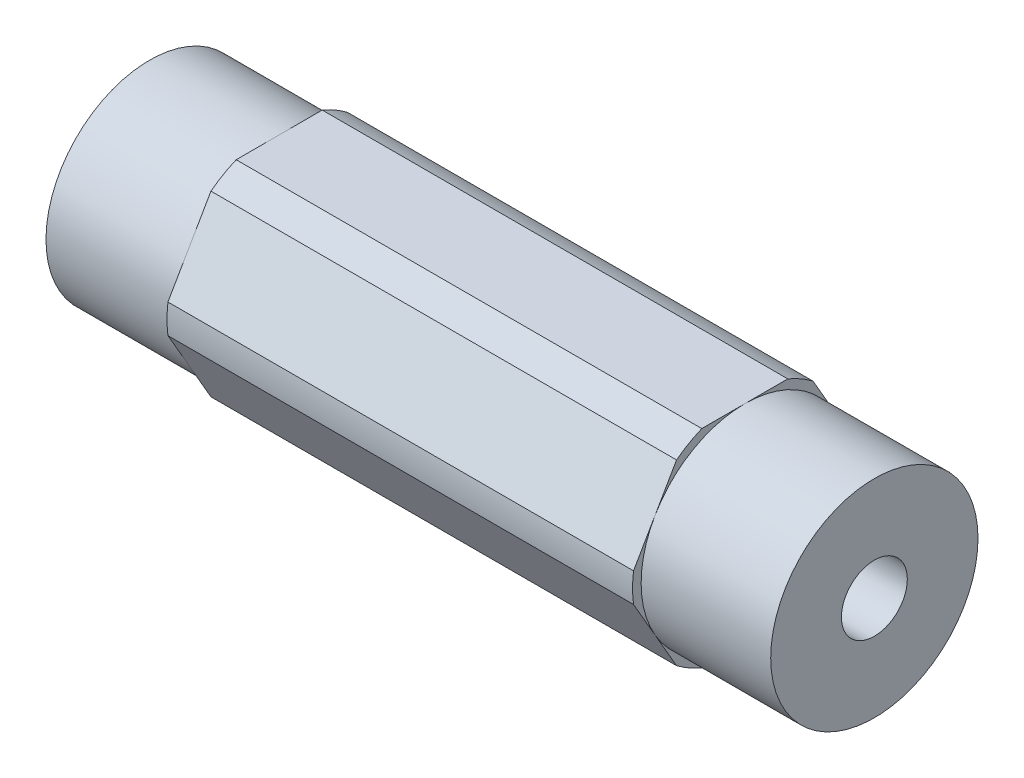
ISO-10303-21;
HEADER;
FILE_DESCRIPTION(('STEP AP214'),'2;1');
FILE_NAME('part.step','',(''),(''),'','','');
FILE_SCHEMA(('AUTOMOTIVE_DESIGN { 1 0 10303 214 1 1 1 1 }'));
ENDSEC;
DATA;
#1=APPLICATION_CONTEXT('core data for automotive mechanical design processes');
#2=APPLICATION_PROTOCOL_DEFINITION('international standard','automotive_design',2000,#1);
#3=PRODUCT_CONTEXT('',#1,'mechanical');
#4=PRODUCT('Part','Part','',(#3));
#5=PRODUCT_RELATED_PRODUCT_CATEGORY('part','',(#4));
#6=PRODUCT_DEFINITION_FORMATION('','',#4);
#7=PRODUCT_DEFINITION_CONTEXT('part definition',#1,'design');
#8=PRODUCT_DEFINITION('design','',#6,#7);
#9=PRODUCT_DEFINITION_SHAPE('','',#8);
#10=(LENGTH_UNIT() NAMED_UNIT(*) SI_UNIT(.MILLI.,.METRE.));
#11=(NAMED_UNIT(*) PLANE_ANGLE_UNIT() SI_UNIT($,.RADIAN.));
#12=(NAMED_UNIT(*) SI_UNIT($,.STERADIAN.) SOLID_ANGLE_UNIT());
#13=UNCERTAINTY_MEASURE_WITH_UNIT(LENGTH_MEASURE(1.E-05),#10,'distance_accuracy_value','');
#14=(GEOMETRIC_REPRESENTATION_CONTEXT(3) GLOBAL_UNCERTAINTY_ASSIGNED_CONTEXT((#13)) GLOBAL_UNIT_ASSIGNED_CONTEXT((#10,
#11,#12)) REPRESENTATION_CONTEXT('',''));
#15=CARTESIAN_POINT('',(0.,0.,0.));
#16=DIRECTION('',(0.,0.,1.));
#17=DIRECTION('',(1.,0.,0.));
#18=AXIS2_PLACEMENT_3D('',#15,#16,#17);
#19=CARTESIAN_POINT('',(-22.1996,0.,0.));
#20=DIRECTION('',(1.,0.,0.));
#21=DIRECTION('',(0.,0.,-1.));
#22=AXIS2_PLACEMENT_3D('',#19,#20,#21);
#23=PLANE('',#22);
#24=CARTESIAN_POINT('',(-22.1996,0.,0.));
#25=DIRECTION('',(1.,0.,0.));
#26=DIRECTION('',(0.,0.,-1.));
#27=AXIS2_PLACEMENT_3D('',#24,#25,#26);
#28=CIRCLE('',#27,2.0193);
#29=CARTESIAN_POINT('',(-22.1996,0.,-2.0193));
#30=VERTEX_POINT('',#29);
#31=EDGE_CURVE('E263',#30,#30,#28,.T.);
#32=ORIENTED_EDGE('',*,*,#31,.T.);
#33=EDGE_LOOP('',(#32));
#34=FACE_BOUND('',#33,.T.);
#35=CARTESIAN_POINT('',(-22.1996,0.,0.));
#36=DIRECTION('',(1.,0.,0.));
#37=DIRECTION('',(0.,0.,-1.));
#38=AXIS2_PLACEMENT_3D('',#35,#36,#37);
#39=CIRCLE('',#38,6.35);
#40=CARTESIAN_POINT('',(-22.1996,0.,-6.35));
#41=VERTEX_POINT('',#40);
#42=EDGE_CURVE('E73',#41,#41,#39,.F.);
#43=ORIENTED_EDGE('',*,*,#42,.T.);
#44=EDGE_LOOP('',(#43));
#45=FACE_BOUND('',#44,.T.);
#46=ADVANCED_FACE('F65',(#34,#45),#23,.F.);
#47=CARTESIAN_POINT('',(22.1996,3.175,-5.49926131403119));
#48=DIRECTION('',(0.,-0.5,0.866025403784438));
#49=DIRECTION('',(0.,-0.866025403784438,-0.5));
#50=AXIS2_PLACEMENT_3D('',#47,#48,#49);
#51=PLANE('',#50);
#52=DIRECTION('',(-1.,0.,0.));
#53=VECTOR('',#52,1.);
#54=CARTESIAN_POINT('',(22.1996,0.893039571032185,-6.81675178197583));
#55=LINE('',#54,#53);
#56=CARTESIAN_POINT('',(14.2621,0.893039571032185,-6.81675178197583));
#57=VERTEX_POINT('',#56);
#58=CARTESIAN_POINT('',(-14.2621,0.893039571032185,-6.81675178197583));
#59=VERTEX_POINT('',#58);
#60=EDGE_CURVE('E222',#57,#59,#55,.T.);
#61=ORIENTED_EDGE('',*,*,#60,.T.);
#62=DIRECTION('',(0.,0.866025403784438,0.5));
#63=VECTOR('',#62,1.);
#64=CARTESIAN_POINT('',(-14.2621,3.175,-5.49926131403119));
#65=LINE('',#64,#63);
#66=CARTESIAN_POINT('',(-14.2621,3.175,-5.49926131403119));
#67=VERTEX_POINT('',#66);
#68=EDGE_CURVE('E80',#59,#67,#65,.T.);
#69=ORIENTED_EDGE('',*,*,#68,.T.);
#70=CARTESIAN_POINT('',(-14.2621,5.45696042896782,-4.18177084608654));
#71=VERTEX_POINT('',#70);
#72=EDGE_CURVE('E191',#67,#71,#65,.T.);
#73=ORIENTED_EDGE('',*,*,#72,.T.);
#74=DIRECTION('',(-1.,0.,0.));
#75=VECTOR('',#74,1.);
#76=CARTESIAN_POINT('',(22.1996,5.45696042896782,-4.18177084608654));
#77=LINE('',#76,#75);
#78=CARTESIAN_POINT('',(14.2621,5.45696042896782,-4.18177084608654));
#79=VERTEX_POINT('',#78);
#80=EDGE_CURVE('E297',#79,#71,#77,.T.);
#81=ORIENTED_EDGE('',*,*,#80,.F.);
#82=DIRECTION('',(0.,0.866025403784438,0.5));
#83=VECTOR('',#82,1.);
#84=CARTESIAN_POINT('',(14.2621,3.175,-5.49926131403119));
#85=LINE('',#84,#83);
#86=CARTESIAN_POINT('',(14.2621,3.175,-5.49926131403119));
#87=VERTEX_POINT('',#86);
#88=EDGE_CURVE('E257',#87,#79,#85,.T.);
#89=ORIENTED_EDGE('',*,*,#88,.F.);
#90=EDGE_CURVE('E259',#57,#87,#85,.T.);
#91=ORIENTED_EDGE('',*,*,#90,.F.);
#92=EDGE_LOOP('',(#61,#69,#73,#81,#89,#91));
#93=FACE_BOUND('',#92,.T.);
#94=ADVANCED_FACE('F219',(#93),#51,.F.);
#95=CARTESIAN_POINT('',(22.1996,0.,0.));
#96=DIRECTION('',(-1.,0.,0.));
#97=DIRECTION('',(0.,0.,1.));
#98=AXIS2_PLACEMENT_3D('',#95,#96,#97);
#99=CYLINDRICAL_SURFACE('',#98,6.874999966);
#100=ORIENTED_EDGE('',*,*,#80,.T.);
#101=CARTESIAN_POINT('',(-14.2621,0.,0.));
#102=DIRECTION('',(1.,0.,0.));
#103=DIRECTION('',(0.,0.,-1.));
#104=AXIS2_PLACEMENT_3D('',#101,#102,#103);
#105=CIRCLE('',#104,6.874999966);
#106=CARTESIAN_POINT('',(-14.2621,6.35,-2.63498093588929));
#107=VERTEX_POINT('',#106);
#108=EDGE_CURVE('E197',#71,#107,#105,.T.);
#109=ORIENTED_EDGE('',*,*,#108,.T.);
#110=DIRECTION('',(-1.,0.,0.));
#111=VECTOR('',#110,1.);
#112=CARTESIAN_POINT('',(22.1996,6.35,-2.63498093588929));
#113=LINE('',#112,#111);
#114=CARTESIAN_POINT('',(14.2621,6.35,-2.63498093588929));
#115=VERTEX_POINT('',#114);
#116=EDGE_CURVE('E294',#115,#107,#113,.T.);
#117=ORIENTED_EDGE('',*,*,#116,.F.);
#118=CARTESIAN_POINT('',(14.2621,0.,0.));
#119=DIRECTION('',(1.,0.,0.));
#120=DIRECTION('',(0.,0.,-1.));
#121=AXIS2_PLACEMENT_3D('',#118,#119,#120);
#122=CIRCLE('',#121,6.874999966);
#123=EDGE_CURVE('E255',#79,#115,#122,.T.);
#124=ORIENTED_EDGE('',*,*,#123,.F.);
#125=EDGE_LOOP('',(#100,#109,#117,#124));
#126=FACE_BOUND('',#125,.T.);
#127=ADVANCED_FACE('F322',(#126),#99,.T.);
#128=CARTESIAN_POINT('',(22.1996,6.35,0.));
#129=DIRECTION('',(0.,-1.,0.));
#130=DIRECTION('',(0.,0.,-1.));
#131=AXIS2_PLACEMENT_3D('',#128,#129,#130);
#132=PLANE('',#131);
#133=ORIENTED_EDGE('',*,*,#116,.T.);
#134=DIRECTION('',(0.,0.,1.));
#135=VECTOR('',#134,1.);
#136=CARTESIAN_POINT('',(-14.2621,6.35,0.));
#137=LINE('',#136,#135);
#138=CARTESIAN_POINT('',(-14.2621,6.35,0.));
#139=VERTEX_POINT('',#138);
#140=EDGE_CURVE('E361',#107,#139,#137,.T.);
#141=ORIENTED_EDGE('',*,*,#140,.T.);
#142=CARTESIAN_POINT('',(-14.2621,6.35,2.63498093588929));
#143=VERTEX_POINT('',#142);
#144=EDGE_CURVE('E364',#139,#143,#137,.T.);
#145=ORIENTED_EDGE('',*,*,#144,.T.);
#146=DIRECTION('',(-1.,0.,0.));
#147=VECTOR('',#146,1.);
#148=CARTESIAN_POINT('',(22.1996,6.35,2.63498093588929));
#149=LINE('',#148,#147);
#150=CARTESIAN_POINT('',(14.2621,6.35,2.63498093588929));
#151=VERTEX_POINT('',#150);
#152=EDGE_CURVE('E291',#151,#143,#149,.T.);
#153=ORIENTED_EDGE('',*,*,#152,.F.);
#154=DIRECTION('',(0.,0.,1.));
#155=VECTOR('',#154,1.);
#156=CARTESIAN_POINT('',(14.2621,6.35,0.));
#157=LINE('',#156,#155);
#158=CARTESIAN_POINT('',(14.2621,6.35,0.));
#159=VERTEX_POINT('',#158);
#160=EDGE_CURVE('E252',#159,#151,#157,.T.);
#161=ORIENTED_EDGE('',*,*,#160,.F.);
#162=EDGE_CURVE('E254',#115,#159,#157,.T.);
#163=ORIENTED_EDGE('',*,*,#162,.F.);
#164=EDGE_LOOP('',(#133,#141,#145,#153,#161,#163));
#165=FACE_BOUND('',#164,.T.);
#166=ADVANCED_FACE('F329',(#165),#132,.F.);
#167=ORIENTED_EDGE('',*,*,#152,.T.);
#168=CARTESIAN_POINT('',(-14.2621,0.,0.));
#169=DIRECTION('',(1.,0.,0.));
#170=DIRECTION('',(0.,0.,-1.));
#171=AXIS2_PLACEMENT_3D('',#168,#169,#170);
#172=CIRCLE('',#171,6.874999966);
#173=CARTESIAN_POINT('',(-14.2621,5.45696042896782,4.18177084608655));
#174=VERTEX_POINT('',#173);
#175=EDGE_CURVE('E365',#143,#174,#172,.T.);
#176=ORIENTED_EDGE('',*,*,#175,.T.);
#177=DIRECTION('',(-1.,0.,0.));
#178=VECTOR('',#177,1.);
#179=CARTESIAN_POINT('',(22.1996,5.45696042896782,4.18177084608655));
#180=LINE('',#179,#178);
#181=CARTESIAN_POINT('',(14.2621,5.45696042896782,4.18177084608655));
#182=VERTEX_POINT('',#181);
#183=EDGE_CURVE('E288',#182,#174,#180,.T.);
#184=ORIENTED_EDGE('',*,*,#183,.F.);
#185=CARTESIAN_POINT('',(14.2621,0.,0.));
#186=DIRECTION('',(1.,0.,0.));
#187=DIRECTION('',(0.,0.,-1.));
#188=AXIS2_PLACEMENT_3D('',#185,#186,#187);
#189=CIRCLE('',#188,6.874999966);
#190=EDGE_CURVE('E250',#151,#182,#189,.T.);
#191=ORIENTED_EDGE('',*,*,#190,.F.);
#192=EDGE_LOOP('',(#167,#176,#184,#191));
#193=FACE_BOUND('',#192,.T.);
#194=ADVANCED_FACE('F331',(#193),#99,.T.);
#195=CARTESIAN_POINT('',(22.1996,3.175,5.49926131403119));
#196=DIRECTION('',(0.,-0.5,-0.866025403784439));
#197=DIRECTION('',(0.,0.866025403784439,-0.5));
#198=AXIS2_PLACEMENT_3D('',#195,#196,#197);
#199=PLANE('',#198);
#200=ORIENTED_EDGE('',*,*,#183,.T.);
#201=DIRECTION('',(0.,-0.866025403784439,0.5));
#202=VECTOR('',#201,1.);
#203=CARTESIAN_POINT('',(-14.2621,3.175,5.49926131403119));
#204=LINE('',#203,#202);
#205=CARTESIAN_POINT('',(-14.2621,3.175,5.49926131403119));
#206=VERTEX_POINT('',#205);
#207=EDGE_CURVE('E369',#174,#206,#204,.T.);
#208=ORIENTED_EDGE('',*,*,#207,.T.);
#209=CARTESIAN_POINT('',(-14.2621,0.893039571032186,6.81675178197583));
#210=VERTEX_POINT('',#209);
#211=EDGE_CURVE('E370',#206,#210,#204,.T.);
#212=ORIENTED_EDGE('',*,*,#211,.T.);
#213=DIRECTION('',(-1.,0.,0.));
#214=VECTOR('',#213,1.);
#215=CARTESIAN_POINT('',(22.1996,0.893039571032186,6.81675178197583));
#216=LINE('',#215,#214);
#217=CARTESIAN_POINT('',(14.2621,0.893039571032186,6.81675178197583));
#218=VERTEX_POINT('',#217);
#219=EDGE_CURVE('E285',#218,#210,#216,.T.);
#220=ORIENTED_EDGE('',*,*,#219,.F.);
#221=DIRECTION('',(0.,-0.866025403784439,0.5));
#222=VECTOR('',#221,1.);
#223=CARTESIAN_POINT('',(14.2621,3.175,5.49926131403119));
#224=LINE('',#223,#222);
#225=CARTESIAN_POINT('',(14.2621,3.175,5.49926131403119));
#226=VERTEX_POINT('',#225);
#227=EDGE_CURVE('E247',#226,#218,#224,.T.);
#228=ORIENTED_EDGE('',*,*,#227,.F.);
#229=EDGE_CURVE('E249',#182,#226,#224,.T.);
#230=ORIENTED_EDGE('',*,*,#229,.F.);
#231=EDGE_LOOP('',(#200,#208,#212,#220,#228,#230));
#232=FACE_BOUND('',#231,.T.);
#233=ADVANCED_FACE('F348',(#232),#199,.F.);
#234=ORIENTED_EDGE('',*,*,#219,.T.);
#235=CARTESIAN_POINT('',(-14.2621,0.,0.));
#236=DIRECTION('',(1.,0.,0.));
#237=DIRECTION('',(0.,0.,-1.));
#238=AXIS2_PLACEMENT_3D('',#235,#236,#237);
#239=CIRCLE('',#238,6.874999966);
#240=CARTESIAN_POINT('',(-14.2621,-0.893039571032186,6.81675178197583));
#241=VERTEX_POINT('',#240);
#242=EDGE_CURVE('E373',#210,#241,#239,.T.);
#243=ORIENTED_EDGE('',*,*,#242,.T.);
#244=DIRECTION('',(-1.,0.,0.));
#245=VECTOR('',#244,1.);
#246=CARTESIAN_POINT('',(22.1996,-0.893039571032186,6.81675178197583));
#247=LINE('',#246,#245);
#248=CARTESIAN_POINT('',(14.2621,-0.893039571032186,6.81675178197583));
#249=VERTEX_POINT('',#248);
#250=EDGE_CURVE('E282',#249,#241,#247,.T.);
#251=ORIENTED_EDGE('',*,*,#250,.F.);
#252=CARTESIAN_POINT('',(14.2621,0.,0.));
#253=DIRECTION('',(1.,0.,0.));
#254=DIRECTION('',(0.,0.,-1.));
#255=AXIS2_PLACEMENT_3D('',#252,#253,#254);
#256=CIRCLE('',#255,6.874999966);
#257=EDGE_CURVE('E245',#218,#249,#256,.T.);
#258=ORIENTED_EDGE('',*,*,#257,.F.);
#259=EDGE_LOOP('',(#234,#243,#251,#258));
#260=FACE_BOUND('',#259,.T.);
#261=ADVANCED_FACE('F346',(#260),#99,.T.);
#262=CARTESIAN_POINT('',(22.1996,-3.175,5.49926131403119));
#263=DIRECTION('',(0.,0.5,-0.866025403784439));
#264=DIRECTION('',(0.,0.866025403784439,0.5));
#265=AXIS2_PLACEMENT_3D('',#262,#263,#264);
#266=PLANE('',#265);
#267=ORIENTED_EDGE('',*,*,#250,.T.);
#268=DIRECTION('',(0.,-0.866025403784439,-0.5));
#269=VECTOR('',#268,1.);
#270=CARTESIAN_POINT('',(-14.2621,-3.175,5.49926131403119));
#271=LINE('',#270,#269);
#272=CARTESIAN_POINT('',(-14.2621,-3.175,5.49926131403119));
#273=VERTEX_POINT('',#272);
#274=EDGE_CURVE('E376',#241,#273,#271,.T.);
#275=ORIENTED_EDGE('',*,*,#274,.T.);
#276=CARTESIAN_POINT('',(-14.2621,-5.45696042896782,4.18177084608654));
#277=VERTEX_POINT('',#276);
#278=EDGE_CURVE('E377',#273,#277,#271,.T.);
#279=ORIENTED_EDGE('',*,*,#278,.T.);
#280=DIRECTION('',(-1.,0.,0.));
#281=VECTOR('',#280,1.);
#282=CARTESIAN_POINT('',(22.1996,-5.45696042896782,4.18177084608655));
#283=LINE('',#282,#281);
#284=CARTESIAN_POINT('',(14.2621,-5.45696042896782,4.18177084608654));
#285=VERTEX_POINT('',#284);
#286=EDGE_CURVE('E279',#285,#277,#283,.T.);
#287=ORIENTED_EDGE('',*,*,#286,.F.);
#288=DIRECTION('',(0.,-0.866025403784439,-0.5));
#289=VECTOR('',#288,1.);
#290=CARTESIAN_POINT('',(14.2621,-3.175,5.49926131403119));
#291=LINE('',#290,#289);
#292=CARTESIAN_POINT('',(14.2621,-3.175,5.49926131403119));
#293=VERTEX_POINT('',#292);
#294=EDGE_CURVE('E242',#293,#285,#291,.T.);
#295=ORIENTED_EDGE('',*,*,#294,.F.);
#296=EDGE_CURVE('E244',#249,#293,#291,.T.);
#297=ORIENTED_EDGE('',*,*,#296,.F.);
#298=EDGE_LOOP('',(#267,#275,#279,#287,#295,#297));
#299=FACE_BOUND('',#298,.T.);
#300=ADVANCED_FACE('F343',(#299),#266,.F.);
#301=ORIENTED_EDGE('',*,*,#286,.T.);
#302=CARTESIAN_POINT('',(-14.2621,0.,0.));
#303=DIRECTION('',(1.,0.,0.));
#304=DIRECTION('',(0.,0.,-1.));
#305=AXIS2_PLACEMENT_3D('',#302,#303,#304);
#306=CIRCLE('',#305,6.874999966);
#307=CARTESIAN_POINT('',(-14.2621,-6.35,2.63498093588928));
#308=VERTEX_POINT('',#307);
#309=EDGE_CURVE('E380',#277,#308,#306,.T.);
#310=ORIENTED_EDGE('',*,*,#309,.T.);
#311=DIRECTION('',(-1.,0.,0.));
#312=VECTOR('',#311,1.);
#313=CARTESIAN_POINT('',(22.1996,-6.35,2.63498093588928));
#314=LINE('',#313,#312);
#315=CARTESIAN_POINT('',(14.2621,-6.35,2.63498093588928));
#316=VERTEX_POINT('',#315);
#317=EDGE_CURVE('E276',#316,#308,#314,.T.);
#318=ORIENTED_EDGE('',*,*,#317,.F.);
#319=CARTESIAN_POINT('',(14.2621,0.,0.));
#320=DIRECTION('',(1.,0.,0.));
#321=DIRECTION('',(0.,0.,-1.));
#322=AXIS2_PLACEMENT_3D('',#319,#320,#321);
#323=CIRCLE('',#322,6.874999966);
#324=EDGE_CURVE('E240',#285,#316,#323,.T.);
#325=ORIENTED_EDGE('',*,*,#324,.F.);
#326=EDGE_LOOP('',(#301,#310,#318,#325));
#327=FACE_BOUND('',#326,.T.);
#328=ADVANCED_FACE('F341',(#327),#99,.T.);
#329=CARTESIAN_POINT('',(22.1996,-6.35,0.));
#330=DIRECTION('',(0.,1.,0.));
#331=DIRECTION('',(0.,0.,1.));
#332=AXIS2_PLACEMENT_3D('',#329,#330,#331);
#333=PLANE('',#332);
#334=ORIENTED_EDGE('',*,*,#317,.T.);
#335=DIRECTION('',(0.,0.,-1.));
#336=VECTOR('',#335,1.);
#337=CARTESIAN_POINT('',(-14.2621,-6.35,0.));
#338=LINE('',#337,#336);
#339=CARTESIAN_POINT('',(-14.2621,-6.35,0.));
#340=VERTEX_POINT('',#339);
#341=EDGE_CURVE('E383',#308,#340,#338,.T.);
#342=ORIENTED_EDGE('',*,*,#341,.T.);
#343=CARTESIAN_POINT('',(-14.2621,-6.35,-2.63498093588928));
#344=VERTEX_POINT('',#343);
#345=EDGE_CURVE('E384',#340,#344,#338,.T.);
#346=ORIENTED_EDGE('',*,*,#345,.T.);
#347=DIRECTION('',(-1.,0.,0.));
#348=VECTOR('',#347,1.);
#349=CARTESIAN_POINT('',(22.1996,-6.35,-2.63498093588928));
#350=LINE('',#349,#348);
#351=CARTESIAN_POINT('',(14.2621,-6.35,-2.63498093588928));
#352=VERTEX_POINT('',#351);
#353=EDGE_CURVE('E273',#352,#344,#350,.T.);
#354=ORIENTED_EDGE('',*,*,#353,.F.);
#355=DIRECTION('',(0.,0.,-1.));
#356=VECTOR('',#355,1.);
#357=CARTESIAN_POINT('',(14.2621,-6.35,0.));
#358=LINE('',#357,#356);
#359=CARTESIAN_POINT('',(14.2621,-6.35,0.));
#360=VERTEX_POINT('',#359);
#361=EDGE_CURVE('E237',#360,#352,#358,.T.);
#362=ORIENTED_EDGE('',*,*,#361,.F.);
#363=EDGE_CURVE('E239',#316,#360,#358,.T.);
#364=ORIENTED_EDGE('',*,*,#363,.F.);
#365=EDGE_LOOP('',(#334,#342,#346,#354,#362,#364));
#366=FACE_BOUND('',#365,.T.);
#367=ADVANCED_FACE('F338',(#366),#333,.F.);
#368=ORIENTED_EDGE('',*,*,#353,.T.);
#369=CARTESIAN_POINT('',(-14.2621,0.,0.));
#370=DIRECTION('',(1.,0.,0.));
#371=DIRECTION('',(0.,0.,-1.));
#372=AXIS2_PLACEMENT_3D('',#369,#370,#371);
#373=CIRCLE('',#372,6.874999966);
#374=CARTESIAN_POINT('',(-14.2621,-5.45696042896782,-4.18177084608655));
#375=VERTEX_POINT('',#374);
#376=EDGE_CURVE('E387',#344,#375,#373,.T.);
#377=ORIENTED_EDGE('',*,*,#376,.T.);
#378=DIRECTION('',(-1.,0.,0.));
#379=VECTOR('',#378,1.);
#380=CARTESIAN_POINT('',(22.1996,-5.45696042896782,-4.18177084608655));
#381=LINE('',#380,#379);
#382=CARTESIAN_POINT('',(14.2621,-5.45696042896782,-4.18177084608655));
#383=VERTEX_POINT('',#382);
#384=EDGE_CURVE('E270',#383,#375,#381,.T.);
#385=ORIENTED_EDGE('',*,*,#384,.F.);
#386=CARTESIAN_POINT('',(14.2621,0.,0.));
#387=DIRECTION('',(1.,0.,0.));
#388=DIRECTION('',(0.,0.,-1.));
#389=AXIS2_PLACEMENT_3D('',#386,#387,#388);
#390=CIRCLE('',#389,6.874999966);
#391=EDGE_CURVE('E235',#352,#383,#390,.T.);
#392=ORIENTED_EDGE('',*,*,#391,.F.);
#393=EDGE_LOOP('',(#368,#377,#385,#392));
#394=FACE_BOUND('',#393,.T.);
#395=ADVANCED_FACE('F336',(#394),#99,.T.);
#396=CARTESIAN_POINT('',(22.1996,-3.175,-5.49926131403119));
#397=DIRECTION('',(0.,0.5,0.866025403784439));
#398=DIRECTION('',(0.,-0.866025403784439,0.5));
#399=AXIS2_PLACEMENT_3D('',#396,#397,#398);
#400=PLANE('',#399);
#401=ORIENTED_EDGE('',*,*,#384,.T.);
#402=DIRECTION('',(0.,0.866025403784439,-0.5));
#403=VECTOR('',#402,1.);
#404=CARTESIAN_POINT('',(-14.2621,-3.175,-5.49926131403119));
#405=LINE('',#404,#403);
#406=CARTESIAN_POINT('',(-14.2621,-3.175,-5.49926131403119));
#407=VERTEX_POINT('',#406);
#408=EDGE_CURVE('E390',#375,#407,#405,.T.);
#409=ORIENTED_EDGE('',*,*,#408,.T.);
#410=CARTESIAN_POINT('',(-14.2621,-0.893039571032186,-6.81675178197583));
#411=VERTEX_POINT('',#410);
#412=EDGE_CURVE('E206',#407,#411,#405,.T.);
#413=ORIENTED_EDGE('',*,*,#412,.T.);
#414=DIRECTION('',(-1.,0.,0.));
#415=VECTOR('',#414,1.);
#416=CARTESIAN_POINT('',(22.1996,-0.893039571032186,-6.81675178197583));
#417=LINE('',#416,#415);
#418=CARTESIAN_POINT('',(14.2621,-0.893039571032186,-6.81675178197583));
#419=VERTEX_POINT('',#418);
#420=EDGE_CURVE('E267',#419,#411,#417,.T.);
#421=ORIENTED_EDGE('',*,*,#420,.F.);
#422=DIRECTION('',(0.,0.866025403784439,-0.5));
#423=VECTOR('',#422,1.);
#424=CARTESIAN_POINT('',(14.2621,-3.175,-5.49926131403119));
#425=LINE('',#424,#423);
#426=CARTESIAN_POINT('',(14.2621,-3.175,-5.49926131403119));
#427=VERTEX_POINT('',#426);
#428=EDGE_CURVE('E87',#427,#419,#425,.T.);
#429=ORIENTED_EDGE('',*,*,#428,.F.);
#430=EDGE_CURVE('E234',#383,#427,#425,.T.);
#431=ORIENTED_EDGE('',*,*,#430,.F.);
#432=EDGE_LOOP('',(#401,#409,#413,#421,#429,#431));
#433=FACE_BOUND('',#432,.T.);
#434=ADVANCED_FACE('F333',(#433),#400,.F.);
#435=ORIENTED_EDGE('',*,*,#420,.T.);
#436=CARTESIAN_POINT('',(-14.2621,0.,0.));
#437=DIRECTION('',(1.,0.,0.));
#438=DIRECTION('',(0.,0.,-1.));
#439=AXIS2_PLACEMENT_3D('',#436,#437,#438);
#440=CIRCLE('',#439,6.874999966);
#441=EDGE_CURVE('E12',#411,#59,#440,.T.);
#442=ORIENTED_EDGE('',*,*,#441,.T.);
#443=ORIENTED_EDGE('',*,*,#60,.F.);
#444=CARTESIAN_POINT('',(14.2621,0.,0.));
#445=DIRECTION('',(1.,0.,0.));
#446=DIRECTION('',(0.,0.,-1.));
#447=AXIS2_PLACEMENT_3D('',#444,#445,#446);
#448=CIRCLE('',#447,6.874999966);
#449=EDGE_CURVE('E302',#419,#57,#448,.T.);
#450=ORIENTED_EDGE('',*,*,#449,.F.);
#451=EDGE_LOOP('',(#435,#442,#443,#450));
#452=FACE_BOUND('',#451,.T.);
#453=ADVANCED_FACE('F332',(#452),#99,.T.);
#454=CARTESIAN_POINT('',(22.1996,0.,0.));
#455=DIRECTION('',(1.,0.,0.));
#456=DIRECTION('',(0.,0.,-1.));
#457=AXIS2_PLACEMENT_3D('',#454,#455,#456);
#458=PLANE('',#457);
#459=CARTESIAN_POINT('',(22.1996,0.,0.));
#460=DIRECTION('',(1.,0.,0.));
#461=DIRECTION('',(0.,0.,-1.));
#462=AXIS2_PLACEMENT_3D('',#459,#460,#461);
#463=CIRCLE('',#462,2.0193);
#464=CARTESIAN_POINT('',(22.1996,0.,-2.0193));
#465=VERTEX_POINT('',#464);
#466=EDGE_CURVE('E260',#465,#465,#463,.T.);
#467=ORIENTED_EDGE('',*,*,#466,.F.);
#468=EDGE_LOOP('',(#467));
#469=FACE_BOUND('',#468,.T.);
#470=CARTESIAN_POINT('',(22.1996,0.,0.));
#471=DIRECTION('',(1.,0.,0.));
#472=DIRECTION('',(0.,0.,-1.));
#473=AXIS2_PLACEMENT_3D('',#470,#471,#472);
#474=CIRCLE('',#473,6.35);
#475=CARTESIAN_POINT('',(22.1996,0.,-6.35));
#476=VERTEX_POINT('',#475);
#477=EDGE_CURVE('E299',#476,#476,#474,.T.);
#478=ORIENTED_EDGE('',*,*,#477,.T.);
#479=EDGE_LOOP('',(#478));
#480=FACE_BOUND('',#479,.T.);
#481=ADVANCED_FACE('F325',(#469,#480),#458,.T.);
#482=CARTESIAN_POINT('',(22.1996,0.,0.));
#483=DIRECTION('',(-1.,0.,0.));
#484=DIRECTION('',(0.,0.,1.));
#485=AXIS2_PLACEMENT_3D('',#482,#483,#484);
#486=CYLINDRICAL_SURFACE('',#485,2.0193);
#487=ORIENTED_EDGE('',*,*,#466,.T.);
#488=EDGE_LOOP('',(#487));
#489=FACE_BOUND('',#488,.T.);
#490=ORIENTED_EDGE('',*,*,#31,.F.);
#491=EDGE_LOOP('',(#490));
#492=FACE_BOUND('',#491,.T.);
#493=ADVANCED_FACE('F67',(#489,#492),#486,.F.);
#494=CARTESIAN_POINT('',(14.2621,0.,0.));
#495=DIRECTION('',(1.,0.,0.));
#496=DIRECTION('',(0.,0.,-1.));
#497=AXIS2_PLACEMENT_3D('',#494,#495,#496);
#498=PLANE('',#497);
#499=ORIENTED_EDGE('',*,*,#90,.T.);
#500=CARTESIAN_POINT('',(14.2621,0.,0.));
#501=DIRECTION('',(1.,0.,0.));
#502=DIRECTION('',(0.,0.,-1.));
#503=AXIS2_PLACEMENT_3D('',#500,#501,#502);
#504=CIRCLE('',#503,6.35);
#505=EDGE_CURVE('E223',#427,#87,#504,.T.);
#506=ORIENTED_EDGE('',*,*,#505,.F.);
#507=ORIENTED_EDGE('',*,*,#428,.T.);
#508=ORIENTED_EDGE('',*,*,#449,.T.);
#509=EDGE_LOOP('',(#499,#506,#507,#508));
#510=FACE_BOUND('',#509,.T.);
#511=ADVANCED_FACE('F437',(#510),#498,.T.);
#512=ORIENTED_EDGE('',*,*,#88,.T.);
#513=ORIENTED_EDGE('',*,*,#123,.T.);
#514=ORIENTED_EDGE('',*,*,#162,.T.);
#515=EDGE_CURVE('E227',#87,#159,#504,.T.);
#516=ORIENTED_EDGE('',*,*,#515,.F.);
#517=EDGE_LOOP('',(#512,#513,#514,#516));
#518=FACE_BOUND('',#517,.T.);
#519=ADVANCED_FACE('F431',(#518),#498,.T.);
#520=ORIENTED_EDGE('',*,*,#160,.T.);
#521=ORIENTED_EDGE('',*,*,#190,.T.);
#522=ORIENTED_EDGE('',*,*,#229,.T.);
#523=EDGE_CURVE('E232',#159,#226,#504,.T.);
#524=ORIENTED_EDGE('',*,*,#523,.F.);
#525=EDGE_LOOP('',(#520,#521,#522,#524));
#526=FACE_BOUND('',#525,.T.);
#527=ADVANCED_FACE('F420',(#526),#498,.T.);
#528=ORIENTED_EDGE('',*,*,#227,.T.);
#529=ORIENTED_EDGE('',*,*,#257,.T.);
#530=ORIENTED_EDGE('',*,*,#296,.T.);
#531=EDGE_CURVE('E425',#226,#293,#504,.T.);
#532=ORIENTED_EDGE('',*,*,#531,.F.);
#533=EDGE_LOOP('',(#528,#529,#530,#532));
#534=FACE_BOUND('',#533,.T.);
#535=ADVANCED_FACE('F453',(#534),#498,.T.);
#536=ORIENTED_EDGE('',*,*,#294,.T.);
#537=ORIENTED_EDGE('',*,*,#324,.T.);
#538=ORIENTED_EDGE('',*,*,#363,.T.);
#539=EDGE_CURVE('E439',#293,#360,#504,.T.);
#540=ORIENTED_EDGE('',*,*,#539,.F.);
#541=EDGE_LOOP('',(#536,#537,#538,#540));
#542=FACE_BOUND('',#541,.T.);
#543=ADVANCED_FACE('F447',(#542),#498,.T.);
#544=ORIENTED_EDGE('',*,*,#361,.T.);
#545=ORIENTED_EDGE('',*,*,#391,.T.);
#546=ORIENTED_EDGE('',*,*,#430,.T.);
#547=EDGE_CURVE('E225',#360,#427,#504,.T.);
#548=ORIENTED_EDGE('',*,*,#547,.F.);
#549=EDGE_LOOP('',(#544,#545,#546,#548));
#550=FACE_BOUND('',#549,.T.);
#551=ADVANCED_FACE('F435',(#550),#498,.T.);
#552=CARTESIAN_POINT('',(14.2621,0.,0.));
#553=DIRECTION('',(1.,0.,0.));
#554=DIRECTION('',(0.,0.,-1.));
#555=AXIS2_PLACEMENT_3D('',#552,#553,#554);
#556=CYLINDRICAL_SURFACE('',#555,6.35);
#557=ORIENTED_EDGE('',*,*,#477,.F.);
#558=EDGE_LOOP('',(#557));
#559=FACE_BOUND('',#558,.T.);
#560=ORIENTED_EDGE('',*,*,#505,.T.);
#561=ORIENTED_EDGE('',*,*,#515,.T.);
#562=ORIENTED_EDGE('',*,*,#523,.T.);
#563=ORIENTED_EDGE('',*,*,#531,.T.);
#564=ORIENTED_EDGE('',*,*,#539,.T.);
#565=ORIENTED_EDGE('',*,*,#547,.T.);
#566=EDGE_LOOP('',(#560,#561,#562,#563,#564,#565));
#567=FACE_BOUND('',#566,.T.);
#568=ADVANCED_FACE('F427',(#559,#567),#556,.T.);
#569=CARTESIAN_POINT('',(-14.2621,0.,0.));
#570=DIRECTION('',(1.,0.,0.));
#571=DIRECTION('',(0.,0.,-1.));
#572=AXIS2_PLACEMENT_3D('',#569,#570,#571);
#573=PLANE('',#572);
#574=ORIENTED_EDGE('',*,*,#441,.F.);
#575=ORIENTED_EDGE('',*,*,#412,.F.);
#576=CARTESIAN_POINT('',(-14.2621,0.,0.));
#577=DIRECTION('',(1.,0.,0.));
#578=DIRECTION('',(0.,0.,-1.));
#579=AXIS2_PLACEMENT_3D('',#576,#577,#578);
#580=CIRCLE('',#579,6.35);
#581=EDGE_CURVE('E203',#407,#67,#580,.T.);
#582=ORIENTED_EDGE('',*,*,#581,.T.);
#583=ORIENTED_EDGE('',*,*,#68,.F.);
#584=EDGE_LOOP('',(#574,#575,#582,#583));
#585=FACE_BOUND('',#584,.T.);
#586=ADVANCED_FACE('F204',(#585),#573,.F.);
#587=EDGE_CURVE('E194',#67,#139,#580,.T.);
#588=ORIENTED_EDGE('',*,*,#587,.T.);
#589=ORIENTED_EDGE('',*,*,#140,.F.);
#590=ORIENTED_EDGE('',*,*,#108,.F.);
#591=ORIENTED_EDGE('',*,*,#72,.F.);
#592=EDGE_LOOP('',(#588,#589,#590,#591));
#593=FACE_BOUND('',#592,.T.);
#594=ADVANCED_FACE('F192',(#593),#573,.F.);
#595=EDGE_CURVE('E217',#139,#206,#580,.T.);
#596=ORIENTED_EDGE('',*,*,#595,.T.);
#597=ORIENTED_EDGE('',*,*,#207,.F.);
#598=ORIENTED_EDGE('',*,*,#175,.F.);
#599=ORIENTED_EDGE('',*,*,#144,.F.);
#600=EDGE_LOOP('',(#596,#597,#598,#599));
#601=FACE_BOUND('',#600,.T.);
#602=ADVANCED_FACE('F411',(#601),#573,.F.);
#603=EDGE_CURVE('E406',#206,#273,#580,.T.);
#604=ORIENTED_EDGE('',*,*,#603,.T.);
#605=ORIENTED_EDGE('',*,*,#274,.F.);
#606=ORIENTED_EDGE('',*,*,#242,.F.);
#607=ORIENTED_EDGE('',*,*,#211,.F.);
#608=EDGE_LOOP('',(#604,#605,#606,#607));
#609=FACE_BOUND('',#608,.T.);
#610=ADVANCED_FACE('F450',(#609),#573,.F.);
#611=EDGE_CURVE('E403',#273,#340,#580,.T.);
#612=ORIENTED_EDGE('',*,*,#611,.T.);
#613=ORIENTED_EDGE('',*,*,#341,.F.);
#614=ORIENTED_EDGE('',*,*,#309,.F.);
#615=ORIENTED_EDGE('',*,*,#278,.F.);
#616=EDGE_LOOP('',(#612,#613,#614,#615));
#617=FACE_BOUND('',#616,.T.);
#618=ADVANCED_FACE('F312',(#617),#573,.F.);
#619=EDGE_CURVE('E210',#340,#407,#580,.T.);
#620=ORIENTED_EDGE('',*,*,#619,.T.);
#621=ORIENTED_EDGE('',*,*,#408,.F.);
#622=ORIENTED_EDGE('',*,*,#376,.F.);
#623=ORIENTED_EDGE('',*,*,#345,.F.);
#624=EDGE_LOOP('',(#620,#621,#622,#623));
#625=FACE_BOUND('',#624,.T.);
#626=ADVANCED_FACE('F307',(#625),#573,.F.);
#627=CARTESIAN_POINT('',(-14.2621,0.,0.));
#628=DIRECTION('',(-1.,0.,0.));
#629=DIRECTION('',(0.,0.,1.));
#630=AXIS2_PLACEMENT_3D('',#627,#628,#629);
#631=CYLINDRICAL_SURFACE('',#630,6.35);
#632=ORIENTED_EDGE('',*,*,#587,.F.);
#633=ORIENTED_EDGE('',*,*,#581,.F.);
#634=ORIENTED_EDGE('',*,*,#619,.F.);
#635=ORIENTED_EDGE('',*,*,#611,.F.);
#636=ORIENTED_EDGE('',*,*,#603,.F.);
#637=ORIENTED_EDGE('',*,*,#595,.F.);
#638=EDGE_LOOP('',(#632,#633,#634,#635,#636,#637));
#639=FACE_BOUND('',#638,.T.);
#640=ORIENTED_EDGE('',*,*,#42,.F.);
#641=EDGE_LOOP('',(#640));
#642=FACE_BOUND('',#641,.T.);
#643=ADVANCED_FACE('F213',(#639,#642),#631,.T.);
#644=CLOSED_SHELL('',(#46,#94,#127,#166,#194,#233,#261,#300,#328,#367,#395,#434,#453,#481,#493,
#511,#519,#527,#535,#543,#551,#568,#586,#594,#602,#610,#618,#626,#643));
#645=MANIFOLD_SOLID_BREP('B2',#644);
#646=ADVANCED_BREP_SHAPE_REPRESENTATION('',(#18,#645),#14);
#647=SHAPE_DEFINITION_REPRESENTATION(#9,#646);
ENDSEC;
END-ISO-10303-21;
